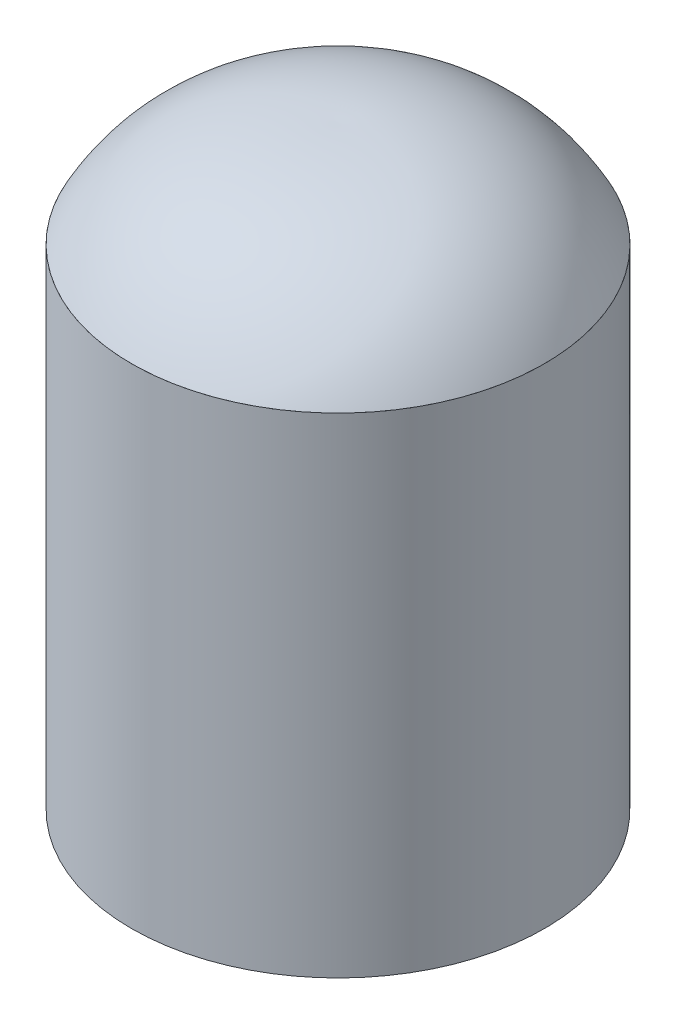
ISO-10303-21;
HEADER;
FILE_DESCRIPTION(('STEP AP214'),'2;1');
FILE_NAME('part.step','',(''),(''),'','','');
FILE_SCHEMA(('AUTOMOTIVE_DESIGN { 1 0 10303 214 1 1 1 1 }'));
ENDSEC;
DATA;
#1=APPLICATION_CONTEXT('core data for automotive mechanical design processes');
#2=APPLICATION_PROTOCOL_DEFINITION('international standard','automotive_design',2000,#1);
#3=PRODUCT_CONTEXT('',#1,'mechanical');
#4=PRODUCT('Part','Part','',(#3));
#5=PRODUCT_RELATED_PRODUCT_CATEGORY('part','',(#4));
#6=PRODUCT_DEFINITION_FORMATION('','',#4);
#7=PRODUCT_DEFINITION_CONTEXT('part definition',#1,'design');
#8=PRODUCT_DEFINITION('design','',#6,#7);
#9=PRODUCT_DEFINITION_SHAPE('','',#8);
#10=(LENGTH_UNIT() NAMED_UNIT(*) SI_UNIT(.MILLI.,.METRE.));
#11=(NAMED_UNIT(*) PLANE_ANGLE_UNIT() SI_UNIT($,.RADIAN.));
#12=(NAMED_UNIT(*) SI_UNIT($,.STERADIAN.) SOLID_ANGLE_UNIT());
#13=UNCERTAINTY_MEASURE_WITH_UNIT(LENGTH_MEASURE(1.E-05),#10,'distance_accuracy_value','');
#14=(GEOMETRIC_REPRESENTATION_CONTEXT(3) GLOBAL_UNCERTAINTY_ASSIGNED_CONTEXT((#13)) GLOBAL_UNIT_ASSIGNED_CONTEXT((#10,
#11,#12)) REPRESENTATION_CONTEXT('',''));
#15=CARTESIAN_POINT('',(0.,0.,0.));
#16=DIRECTION('',(0.,0.,1.));
#17=DIRECTION('',(1.,0.,0.));
#18=AXIS2_PLACEMENT_3D('',#15,#16,#17);
#19=CARTESIAN_POINT('',(0.,0.,0.));
#20=DIRECTION('',(0.,1.,0.));
#21=DIRECTION('',(0.,0.,1.));
#22=AXIS2_PLACEMENT_3D('',#19,#20,#21);
#23=CYLINDRICAL_SURFACE('',#22,31.75);
#24=CARTESIAN_POINT('',(0.,-87.884,0.));
#25=DIRECTION('',(0.,1.,0.));
#26=DIRECTION('',(0.,0.,1.));
#27=AXIS2_PLACEMENT_3D('',#24,#25,#26);
#28=CIRCLE('',#27,31.75);
#29=CARTESIAN_POINT('',(0.,-87.884,31.75));
#30=VERTEX_POINT('',#29);
#31=EDGE_CURVE('E66',#30,#30,#28,.T.);
#32=ORIENTED_EDGE('',*,*,#31,.F.);
#33=EDGE_LOOP('',(#32));
#34=FACE_BOUND('',#33,.T.);
#35=CARTESIAN_POINT('',(0.,0.,0.));
#36=DIRECTION('',(0.,1.,0.));
#37=DIRECTION('',(0.,0.,1.));
#38=AXIS2_PLACEMENT_3D('',#35,#36,#37);
#39=CIRCLE('',#38,31.75);
#40=CARTESIAN_POINT('',(0.,0.,31.75));
#41=VERTEX_POINT('',#40);
#42=EDGE_CURVE('E11',#41,#41,#39,.T.);
#43=ORIENTED_EDGE('',*,*,#42,.T.);
#44=EDGE_LOOP('',(#43));
#45=FACE_BOUND('',#44,.T.);
#46=ADVANCED_FACE('F49',(#34,#45),#23,.F.);
#47=CARTESIAN_POINT('',(0.,0.,0.));
#48=DIRECTION('',(0.,1.,0.));
#49=DIRECTION('',(0.,0.,1.));
#50=AXIS2_PLACEMENT_3D('',#47,#48,#49);
#51=PLANE('',#50);
#52=CARTESIAN_POINT('',(0.,0.,0.));
#53=DIRECTION('',(0.,1.,0.));
#54=DIRECTION('',(0.,0.,1.));
#55=AXIS2_PLACEMENT_3D('',#52,#53,#54);
#56=CIRCLE('',#55,37.084);
#57=CARTESIAN_POINT('',(0.,0.,37.084));
#58=VERTEX_POINT('',#57);
#59=EDGE_CURVE('E56',#58,#58,#56,.T.);
#60=ORIENTED_EDGE('',*,*,#59,.T.);
#61=EDGE_LOOP('',(#60));
#62=FACE_BOUND('',#61,.T.);
#63=ORIENTED_EDGE('',*,*,#42,.F.);
#64=EDGE_LOOP('',(#63));
#65=FACE_BOUND('',#64,.T.);
#66=ADVANCED_FACE('F76',(#62,#65),#51,.T.);
#67=CARTESIAN_POINT('',(0.,0.,0.));
#68=DIRECTION('',(0.,1.,0.));
#69=DIRECTION('',(0.,0.,1.));
#70=AXIS2_PLACEMENT_3D('',#67,#68,#69);
#71=CYLINDRICAL_SURFACE('',#70,37.084);
#72=CARTESIAN_POINT('',(0.,-87.884,0.));
#73=DIRECTION('',(0.,1.,0.));
#74=DIRECTION('',(0.,0.,1.));
#75=AXIS2_PLACEMENT_3D('',#72,#73,#74);
#76=CIRCLE('',#75,37.084);
#77=CARTESIAN_POINT('',(0.,-87.884,37.084));
#78=VERTEX_POINT('',#77);
#79=EDGE_CURVE('E61',#78,#78,#76,.T.);
#80=ORIENTED_EDGE('',*,*,#79,.T.);
#81=EDGE_LOOP('',(#80));
#82=FACE_BOUND('',#81,.T.);
#83=ORIENTED_EDGE('',*,*,#59,.F.);
#84=EDGE_LOOP('',(#83));
#85=FACE_BOUND('',#84,.T.);
#86=ADVANCED_FACE('F80',(#82,#85),#71,.T.);
#87=CARTESIAN_POINT('',(0.,-87.884,0.));
#88=DIRECTION('',(0.,1.,0.));
#89=DIRECTION('',(0.,0.,1.));
#90=AXIS2_PLACEMENT_3D('',#87,#88,#89);
#91=PLANE('',#90);
#92=ORIENTED_EDGE('',*,*,#79,.F.);
#93=EDGE_LOOP('',(#92));
#94=FACE_BOUND('',#93,.T.);
#95=ORIENTED_EDGE('',*,*,#31,.T.);
#96=EDGE_LOOP('',(#95));
#97=FACE_BOUND('',#96,.T.);
#98=ADVANCED_FACE('F73',(#94,#97),#91,.F.);
#99=CLOSED_SHELL('',(#46,#66,#86,#98));
#100=MANIFOLD_SOLID_BREP('B2',#99);
#101=CARTESIAN_POINT('',(0.,19.05,0.));
#102=CARTESIAN_POINT('',(-26.2610148903666,19.8039372678845,0.));
#103=CARTESIAN_POINT('',(-37.084,0.,0.));
#104=B_SPLINE_CURVE_WITH_KNOTS('',2,(#101,#102,#103),.UNSPECIFIED.,.F.,.F.,(3,3),(0.,1.),.UNSPECIFIED.);
#105=CARTESIAN_POINT('',(0.,0.,0.));
#106=DIRECTION('',(0.,-1.,0.));
#107=AXIS1_PLACEMENT('',#105,#106);
#108=SURFACE_OF_REVOLUTION('',#104,#107);
#109=CARTESIAN_POINT('',(0.,0.,0.));
#110=DIRECTION('',(0.,-1.,0.));
#111=DIRECTION('',(0.,0.,-1.));
#112=AXIS2_PLACEMENT_3D('',#109,#110,#111);
#113=CIRCLE('',#112,37.084);
#114=CARTESIAN_POINT('',(0.,0.,-37.084));
#115=VERTEX_POINT('',#114);
#116=EDGE_CURVE('E47',#115,#115,#113,.T.);
#117=ORIENTED_EDGE('',*,*,#116,.F.);
#118=EDGE_LOOP('',(#117));
#119=FACE_BOUND('',#118,.T.);
#120=CARTESIAN_POINT('',(0.,19.05,0.));
#121=VERTEX_POINT('',#120);
#122=VERTEX_LOOP('',#121);
#123=FACE_BOUND('',#122,.T.);
#124=ADVANCED_FACE('F115',(#119,#123),#108,.T.);
#125=CARTESIAN_POINT('',(0.,0.,0.));
#126=DIRECTION('',(0.,-1.,0.));
#127=DIRECTION('',(0.,0.,-1.));
#128=AXIS2_PLACEMENT_3D('',#125,#126,#127);
#129=PLANE('',#128);
#130=ORIENTED_EDGE('',*,*,#116,.T.);
#131=EDGE_LOOP('',(#130));
#132=FACE_BOUND('',#131,.T.);
#133=ADVANCED_FACE('F124',(#132),#129,.T.);
#134=CLOSED_SHELL('',(#124,#133));
#135=MANIFOLD_SOLID_BREP('B6',#134);
#136=ADVANCED_BREP_SHAPE_REPRESENTATION('',(#18,#100,#135),#14);
#137=SHAPE_DEFINITION_REPRESENTATION(#9,#136);
ENDSEC;
END-ISO-10303-21;
